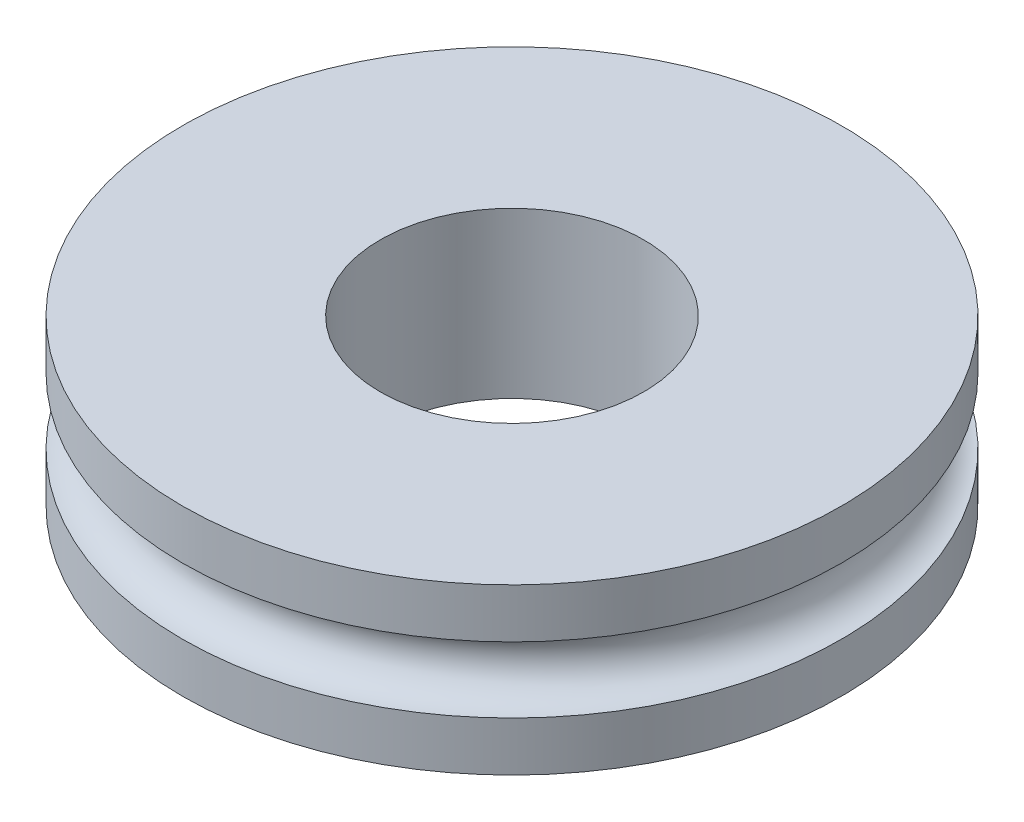
ISO-10303-21;
HEADER;
FILE_DESCRIPTION(('STEP AP214'),'2;1');
FILE_NAME('part.step','',(''),(''),'','','');
FILE_SCHEMA(('AUTOMOTIVE_DESIGN { 1 0 10303 214 1 1 1 1 }'));
ENDSEC;
DATA;
#1=APPLICATION_CONTEXT('core data for automotive mechanical design processes');
#2=APPLICATION_PROTOCOL_DEFINITION('international standard','automotive_design',2000,#1);
#3=PRODUCT_CONTEXT('',#1,'mechanical');
#4=PRODUCT('Part','Part','',(#3));
#5=PRODUCT_RELATED_PRODUCT_CATEGORY('part','',(#4));
#6=PRODUCT_DEFINITION_FORMATION('','',#4);
#7=PRODUCT_DEFINITION_CONTEXT('part definition',#1,'design');
#8=PRODUCT_DEFINITION('design','',#6,#7);
#9=PRODUCT_DEFINITION_SHAPE('','',#8);
#10=(LENGTH_UNIT() NAMED_UNIT(*) SI_UNIT(.MILLI.,.METRE.));
#11=(NAMED_UNIT(*) PLANE_ANGLE_UNIT() SI_UNIT($,.RADIAN.));
#12=(NAMED_UNIT(*) SI_UNIT($,.STERADIAN.) SOLID_ANGLE_UNIT());
#13=UNCERTAINTY_MEASURE_WITH_UNIT(LENGTH_MEASURE(1.E-05),#10,'distance_accuracy_value','');
#14=(GEOMETRIC_REPRESENTATION_CONTEXT(3) GLOBAL_UNCERTAINTY_ASSIGNED_CONTEXT((#13)) GLOBAL_UNIT_ASSIGNED_CONTEXT((#10,
#11,#12)) REPRESENTATION_CONTEXT('',''));
#15=CARTESIAN_POINT('',(0.,0.,0.));
#16=DIRECTION('',(0.,0.,1.));
#17=DIRECTION('',(1.,0.,0.));
#18=AXIS2_PLACEMENT_3D('',#15,#16,#17);
#19=CARTESIAN_POINT('',(0.,-1.25,0.));
#20=DIRECTION('',(0.,1.,0.));
#21=DIRECTION('',(0.,0.,1.));
#22=AXIS2_PLACEMENT_3D('',#19,#20,#21);
#23=CYLINDRICAL_SURFACE('',#22,5.);
#24=CARTESIAN_POINT('',(0.,-0.5,0.));
#25=DIRECTION('',(0.,1.,0.));
#26=DIRECTION('',(0.,0.,1.));
#27=AXIS2_PLACEMENT_3D('',#24,#25,#26);
#28=CIRCLE('',#27,5.);
#29=CARTESIAN_POINT('',(0.,-0.5,5.));
#30=VERTEX_POINT('',#29);
#31=EDGE_CURVE('E35',#30,#30,#28,.T.);
#32=ORIENTED_EDGE('',*,*,#31,.F.);
#33=EDGE_LOOP('',(#32));
#34=FACE_BOUND('',#33,.T.);
#35=CARTESIAN_POINT('',(0.,-1.25,0.));
#36=DIRECTION('',(0.,1.,0.));
#37=DIRECTION('',(0.,0.,1.));
#38=AXIS2_PLACEMENT_3D('',#35,#36,#37);
#39=CIRCLE('',#38,5.);
#40=CARTESIAN_POINT('',(0.,-1.25,5.));
#41=VERTEX_POINT('',#40);
#42=EDGE_CURVE('E10',#41,#41,#39,.T.);
#43=ORIENTED_EDGE('',*,*,#42,.T.);
#44=EDGE_LOOP('',(#43));
#45=FACE_BOUND('',#44,.T.);
#46=ADVANCED_FACE('F31',(#34,#45),#23,.T.);
#47=CARTESIAN_POINT('',(0.,0.5,0.));
#48=DIRECTION('',(0.,-1.,0.));
#49=DIRECTION('',(0.,0.,-1.));
#50=AXIS2_PLACEMENT_3D('',#47,#48,#49);
#51=CIRCLE('',#50,5.);
#52=CARTESIAN_POINT('',(0.,0.5,-5.));
#53=VERTEX_POINT('',#52);
#54=EDGE_CURVE('E47',#53,#53,#51,.T.);
#55=ORIENTED_EDGE('',*,*,#54,.F.);
#56=EDGE_LOOP('',(#55));
#57=FACE_BOUND('',#56,.T.);
#58=CARTESIAN_POINT('',(0.,1.25,0.));
#59=DIRECTION('',(0.,1.,0.));
#60=DIRECTION('',(0.,0.,1.));
#61=AXIS2_PLACEMENT_3D('',#58,#59,#60);
#62=CIRCLE('',#61,5.);
#63=CARTESIAN_POINT('',(0.,1.25,5.));
#64=VERTEX_POINT('',#63);
#65=EDGE_CURVE('E44',#64,#64,#62,.T.);
#66=ORIENTED_EDGE('',*,*,#65,.F.);
#67=EDGE_LOOP('',(#66));
#68=FACE_BOUND('',#67,.T.);
#69=ADVANCED_FACE('F33',(#57,#68),#23,.T.);
#70=CARTESIAN_POINT('',(0.,-1.25,0.));
#71=DIRECTION('',(0.,1.,0.));
#72=DIRECTION('',(0.,0.,1.));
#73=AXIS2_PLACEMENT_3D('',#70,#71,#72);
#74=PLANE('',#73);
#75=CARTESIAN_POINT('',(0.,-1.25,0.));
#76=DIRECTION('',(0.,1.,0.));
#77=DIRECTION('',(0.,0.,1.));
#78=AXIS2_PLACEMENT_3D('',#75,#76,#77);
#79=CIRCLE('',#78,2.);
#80=CARTESIAN_POINT('',(0.,-1.25,2.));
#81=VERTEX_POINT('',#80);
#82=EDGE_CURVE('E39',#81,#81,#79,.T.);
#83=ORIENTED_EDGE('',*,*,#82,.T.);
#84=EDGE_LOOP('',(#83));
#85=FACE_BOUND('',#84,.T.);
#86=ORIENTED_EDGE('',*,*,#42,.F.);
#87=EDGE_LOOP('',(#86));
#88=FACE_BOUND('',#87,.T.);
#89=ADVANCED_FACE('F66',(#85,#88),#74,.F.);
#90=CARTESIAN_POINT('',(0.,-1.25,0.));
#91=DIRECTION('',(0.,1.,0.));
#92=DIRECTION('',(0.,0.,1.));
#93=AXIS2_PLACEMENT_3D('',#90,#91,#92);
#94=CYLINDRICAL_SURFACE('',#93,2.);
#95=ORIENTED_EDGE('',*,*,#82,.F.);
#96=EDGE_LOOP('',(#95));
#97=FACE_BOUND('',#96,.T.);
#98=CARTESIAN_POINT('',(0.,1.25,0.));
#99=DIRECTION('',(0.,1.,0.));
#100=DIRECTION('',(0.,0.,1.));
#101=AXIS2_PLACEMENT_3D('',#98,#99,#100);
#102=CIRCLE('',#101,2.);
#103=CARTESIAN_POINT('',(0.,1.25,2.));
#104=VERTEX_POINT('',#103);
#105=EDGE_CURVE('E52',#104,#104,#102,.T.);
#106=ORIENTED_EDGE('',*,*,#105,.T.);
#107=EDGE_LOOP('',(#106));
#108=FACE_BOUND('',#107,.T.);
#109=ADVANCED_FACE('F72',(#97,#108),#94,.F.);
#110=CARTESIAN_POINT('',(0.,1.25,0.));
#111=DIRECTION('',(0.,1.,0.));
#112=DIRECTION('',(0.,0.,1.));
#113=AXIS2_PLACEMENT_3D('',#110,#111,#112);
#114=PLANE('',#113);
#115=ORIENTED_EDGE('',*,*,#65,.T.);
#116=EDGE_LOOP('',(#115));
#117=FACE_BOUND('',#116,.T.);
#118=ORIENTED_EDGE('',*,*,#105,.F.);
#119=EDGE_LOOP('',(#118));
#120=FACE_BOUND('',#119,.T.);
#121=ADVANCED_FACE('F62',(#117,#120),#114,.T.);
#122=CARTESIAN_POINT('',(0.,0.,0.));
#123=DIRECTION('',(0.,-1.,0.));
#124=DIRECTION('',(0.,0.,-1.));
#125=AXIS2_PLACEMENT_3D('',#122,#123,#124);
#126=TOROIDAL_SURFACE('',#125,5.,0.5);
#127=ORIENTED_EDGE('',*,*,#31,.T.);
#128=EDGE_LOOP('',(#127));
#129=FACE_BOUND('',#128,.T.);
#130=ORIENTED_EDGE('',*,*,#54,.T.);
#131=EDGE_LOOP('',(#130));
#132=FACE_BOUND('',#131,.T.);
#133=ADVANCED_FACE('F93',(#129,#132),#126,.F.);
#134=CLOSED_SHELL('',(#46,#69,#89,#109,#121,#133));
#135=MANIFOLD_SOLID_BREP('B2',#134);
#136=ADVANCED_BREP_SHAPE_REPRESENTATION('',(#18,#135),#14);
#137=SHAPE_DEFINITION_REPRESENTATION(#9,#136);
ENDSEC;
END-ISO-10303-21;
